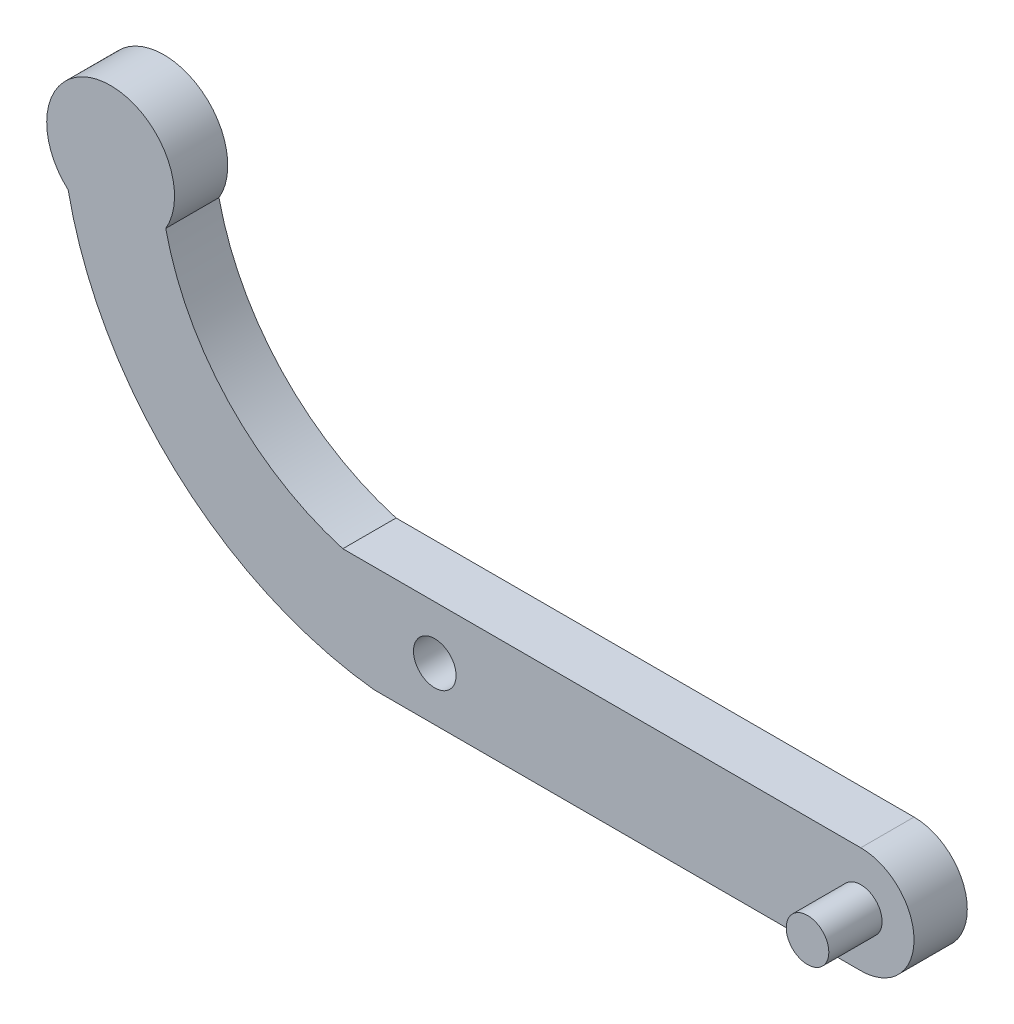
ISO-10303-21;
HEADER;
FILE_DESCRIPTION(('STEP AP214'),'2;1');
FILE_NAME('part.step','',(''),(''),'','','');
FILE_SCHEMA(('AUTOMOTIVE_DESIGN { 1 0 10303 214 1 1 1 1 }'));
ENDSEC;
DATA;
#1=APPLICATION_CONTEXT('core data for automotive mechanical design processes');
#2=APPLICATION_PROTOCOL_DEFINITION('international standard','automotive_design',2000,#1);
#3=PRODUCT_CONTEXT('',#1,'mechanical');
#4=PRODUCT('Part','Part','',(#3));
#5=PRODUCT_RELATED_PRODUCT_CATEGORY('part','',(#4));
#6=PRODUCT_DEFINITION_FORMATION('','',#4);
#7=PRODUCT_DEFINITION_CONTEXT('part definition',#1,'design');
#8=PRODUCT_DEFINITION('design','',#6,#7);
#9=PRODUCT_DEFINITION_SHAPE('','',#8);
#10=(LENGTH_UNIT() NAMED_UNIT(*) SI_UNIT(.MILLI.,.METRE.));
#11=(NAMED_UNIT(*) PLANE_ANGLE_UNIT() SI_UNIT($,.RADIAN.));
#12=(NAMED_UNIT(*) SI_UNIT($,.STERADIAN.) SOLID_ANGLE_UNIT());
#13=UNCERTAINTY_MEASURE_WITH_UNIT(LENGTH_MEASURE(1.E-05),#10,'distance_accuracy_value','');
#14=(GEOMETRIC_REPRESENTATION_CONTEXT(3) GLOBAL_UNCERTAINTY_ASSIGNED_CONTEXT((#13)) GLOBAL_UNIT_ASSIGNED_CONTEXT((#10,
#11,#12)) REPRESENTATION_CONTEXT('',''));
#15=CARTESIAN_POINT('',(0.,0.,0.));
#16=DIRECTION('',(0.,0.,1.));
#17=DIRECTION('',(1.,0.,0.));
#18=AXIS2_PLACEMENT_3D('',#15,#16,#17);
#19=CARTESIAN_POINT('',(-19.2924587651083,28.7084113729155,5.));
#20=DIRECTION('',(0.,0.,1.));
#21=DIRECTION('',(1.,0.,0.));
#22=AXIS2_PLACEMENT_3D('',#19,#20,#21);
#23=PLANE('',#22);
#24=CARTESIAN_POINT('',(22.6780509076825,0.804713338237159,5.));
#25=DIRECTION('',(0.,0.,1.));
#26=DIRECTION('',(1.,0.,0.));
#27=AXIS2_PLACEMENT_3D('',#24,#25,#26);
#28=CIRCLE('',#27,2.);
#29=CARTESIAN_POINT('',(24.6780509076825,0.804713338237159,5.));
#30=VERTEX_POINT('',#29);
#31=EDGE_CURVE('E176',#30,#30,#28,.T.);
#32=ORIENTED_EDGE('',*,*,#31,.F.);
#33=EDGE_LOOP('',(#32));
#34=FACE_BOUND('',#33,.T.);
#35=CARTESIAN_POINT('',(-19.2924587651083,28.7084113729155,5.));
#36=DIRECTION('',(0.,0.,-1.));
#37=DIRECTION('',(1.,0.,0.));
#38=AXIS2_PLACEMENT_3D('',#35,#36,#37);
#39=CIRCLE('',#38,23.8526946732791);
#40=CARTESIAN_POINT('',(-25.9536643251366,5.80471333823716,5.));
#41=VERTEX_POINT('',#40);
#42=CARTESIAN_POINT('',(-42.5787439773952,23.5412105650593,5.));
#43=VERTEX_POINT('',#42);
#44=EDGE_CURVE('E129',#41,#43,#39,.T.);
#45=ORIENTED_EDGE('',*,*,#44,.T.);
#46=CARTESIAN_POINT('',(-47.7560673642883,26.5735895894443,5.));
#47=DIRECTION('',(0.,0.,1.));
#48=DIRECTION('',(1.,0.,0.));
#49=AXIS2_PLACEMENT_3D('',#46,#47,#48);
#50=CIRCLE('',#49,6.);
#51=CARTESIAN_POINT('',(-51.7412575093746,22.0882513070505,5.));
#52=VERTEX_POINT('',#51);
#53=EDGE_CURVE('E87',#43,#52,#50,.T.);
#54=ORIENTED_EDGE('',*,*,#53,.T.);
#55=CARTESIAN_POINT('',(-19.2924587651083,28.7084113729155,5.));
#56=DIRECTION('',(0.,0.,1.));
#57=DIRECTION('',(1.,0.,0.));
#58=AXIS2_PLACEMENT_3D('',#55,#56,#57);
#59=CIRCLE('',#58,33.1172320589081);
#60=CARTESIAN_POINT('',(-23.0471511474845,-4.19528666176284,5.));
#61=VERTEX_POINT('',#60);
#62=EDGE_CURVE('E100',#52,#61,#59,.T.);
#63=ORIENTED_EDGE('',*,*,#62,.T.);
#64=DIRECTION('',(1.,0.,0.));
#65=VECTOR('',#64,1.);
#66=CARTESIAN_POINT('',(-23.0471511474845,-4.19528666176284,5.));
#67=LINE('',#66,#65);
#68=CARTESIAN_POINT('',(22.6780509076825,-4.19528666176284,5.));
#69=VERTEX_POINT('',#68);
#70=EDGE_CURVE('E94',#61,#69,#67,.T.);
#71=ORIENTED_EDGE('',*,*,#70,.T.);
#72=CARTESIAN_POINT('',(22.6780509076825,0.804713338237159,5.));
#73=DIRECTION('',(0.,0.,1.));
#74=DIRECTION('',(1.,0.,0.));
#75=AXIS2_PLACEMENT_3D('',#72,#73,#74);
#76=CIRCLE('',#75,5.);
#77=CARTESIAN_POINT('',(22.6780509076825,5.80471333823716,5.));
#78=VERTEX_POINT('',#77);
#79=EDGE_CURVE('E98',#69,#78,#76,.T.);
#80=ORIENTED_EDGE('',*,*,#79,.T.);
#81=DIRECTION('',(-1.,0.,0.));
#82=VECTOR('',#81,1.);
#83=CARTESIAN_POINT('',(-25.9536643251366,5.80471333823716,5.));
#84=LINE('',#83,#82);
#85=EDGE_CURVE('E50',#78,#41,#84,.T.);
#86=ORIENTED_EDGE('',*,*,#85,.T.);
#87=EDGE_LOOP('',(#45,#54,#63,#71,#80,#86));
#88=FACE_BOUND('',#87,.T.);
#89=CARTESIAN_POINT('',(-17.3219490923175,0.804713338237159,5.));
#90=DIRECTION('',(0.,0.,1.));
#91=DIRECTION('',(1.,0.,0.));
#92=AXIS2_PLACEMENT_3D('',#89,#90,#91);
#93=CIRCLE('',#92,2.);
#94=CARTESIAN_POINT('',(-15.3219490923175,0.804713338237159,5.));
#95=VERTEX_POINT('',#94);
#96=EDGE_CURVE('E122',#95,#95,#93,.T.);
#97=ORIENTED_EDGE('',*,*,#96,.F.);
#98=EDGE_LOOP('',(#97));
#99=FACE_BOUND('',#98,.T.);
#100=ADVANCED_FACE('F33',(#34,#88,#99),#23,.T.);
#101=CARTESIAN_POINT('',(-19.2924587651083,28.7084113729155,0.));
#102=DIRECTION('',(0.,0.,1.));
#103=DIRECTION('',(1.,0.,0.));
#104=AXIS2_PLACEMENT_3D('',#101,#102,#103);
#105=PLANE('',#104);
#106=CARTESIAN_POINT('',(-19.2924587651083,28.7084113729155,0.));
#107=DIRECTION('',(0.,0.,-1.));
#108=DIRECTION('',(1.,0.,0.));
#109=AXIS2_PLACEMENT_3D('',#106,#107,#108);
#110=CIRCLE('',#109,23.8526946732791);
#111=CARTESIAN_POINT('',(-25.9536643251366,5.80471333823716,0.));
#112=VERTEX_POINT('',#111);
#113=CARTESIAN_POINT('',(-42.5787439773952,23.5412105650593,0.));
#114=VERTEX_POINT('',#113);
#115=EDGE_CURVE('E118',#112,#114,#110,.T.);
#116=ORIENTED_EDGE('',*,*,#115,.F.);
#117=DIRECTION('',(-1.,0.,0.));
#118=VECTOR('',#117,1.);
#119=CARTESIAN_POINT('',(-25.9536643251366,5.80471333823716,0.));
#120=LINE('',#119,#118);
#121=CARTESIAN_POINT('',(22.6780509076825,5.80471333823716,0.));
#122=VERTEX_POINT('',#121);
#123=EDGE_CURVE('E79',#122,#112,#120,.T.);
#124=ORIENTED_EDGE('',*,*,#123,.F.);
#125=CARTESIAN_POINT('',(22.6780509076825,0.804713338237159,0.));
#126=DIRECTION('',(0.,0.,1.));
#127=DIRECTION('',(1.,0.,0.));
#128=AXIS2_PLACEMENT_3D('',#125,#126,#127);
#129=CIRCLE('',#128,5.);
#130=CARTESIAN_POINT('',(22.6780509076825,-4.19528666176284,0.));
#131=VERTEX_POINT('',#130);
#132=EDGE_CURVE('E73',#131,#122,#129,.T.);
#133=ORIENTED_EDGE('',*,*,#132,.F.);
#134=DIRECTION('',(1.,0.,0.));
#135=VECTOR('',#134,1.);
#136=CARTESIAN_POINT('',(-23.0471511474845,-4.19528666176284,0.));
#137=LINE('',#136,#135);
#138=CARTESIAN_POINT('',(-23.0471511474845,-4.19528666176284,0.));
#139=VERTEX_POINT('',#138);
#140=EDGE_CURVE('E108',#139,#131,#137,.T.);
#141=ORIENTED_EDGE('',*,*,#140,.F.);
#142=CARTESIAN_POINT('',(-19.2924587651083,28.7084113729155,0.));
#143=DIRECTION('',(0.,0.,1.));
#144=DIRECTION('',(1.,0.,0.));
#145=AXIS2_PLACEMENT_3D('',#142,#143,#144);
#146=CIRCLE('',#145,33.1172320589081);
#147=CARTESIAN_POINT('',(-51.7412575093746,22.0882513070505,0.));
#148=VERTEX_POINT('',#147);
#149=EDGE_CURVE('E124',#148,#139,#146,.T.);
#150=ORIENTED_EDGE('',*,*,#149,.F.);
#151=CARTESIAN_POINT('',(-47.7560673642883,26.5735895894443,0.));
#152=DIRECTION('',(0.,0.,1.));
#153=DIRECTION('',(1.,0.,0.));
#154=AXIS2_PLACEMENT_3D('',#151,#152,#153);
#155=CIRCLE('',#154,6.);
#156=EDGE_CURVE('E121',#114,#148,#155,.T.);
#157=ORIENTED_EDGE('',*,*,#156,.F.);
#158=EDGE_LOOP('',(#116,#124,#133,#141,#150,#157));
#159=FACE_BOUND('',#158,.T.);
#160=CARTESIAN_POINT('',(-17.3219490923175,0.804713338237159,0.));
#161=DIRECTION('',(0.,0.,1.));
#162=DIRECTION('',(1.,0.,0.));
#163=AXIS2_PLACEMENT_3D('',#160,#161,#162);
#164=CIRCLE('',#163,2.);
#165=CARTESIAN_POINT('',(-15.3219490923175,0.804713338237159,0.));
#166=VERTEX_POINT('',#165);
#167=EDGE_CURVE('E175',#166,#166,#164,.T.);
#168=ORIENTED_EDGE('',*,*,#167,.T.);
#169=EDGE_LOOP('',(#168));
#170=FACE_BOUND('',#169,.T.);
#171=ADVANCED_FACE('F138',(#159,#170),#105,.F.);
#172=CARTESIAN_POINT('',(-19.2924587651083,28.7084113729155,5.));
#173=DIRECTION('',(0.,0.,-1.));
#174=DIRECTION('',(-1.,0.,0.));
#175=AXIS2_PLACEMENT_3D('',#172,#173,#174);
#176=CYLINDRICAL_SURFACE('',#175,23.8526946732791);
#177=ORIENTED_EDGE('',*,*,#115,.T.);
#178=DIRECTION('',(0.,0.,-1.));
#179=VECTOR('',#178,1.);
#180=CARTESIAN_POINT('',(-42.5787439773952,23.5412105650593,5.));
#181=LINE('',#180,#179);
#182=EDGE_CURVE('E11',#43,#114,#181,.T.);
#183=ORIENTED_EDGE('',*,*,#182,.F.);
#184=ORIENTED_EDGE('',*,*,#44,.F.);
#185=DIRECTION('',(0.,0.,-1.));
#186=VECTOR('',#185,1.);
#187=CARTESIAN_POINT('',(-25.9536643251366,5.80471333823716,5.));
#188=LINE('',#187,#186);
#189=EDGE_CURVE('E114',#41,#112,#188,.T.);
#190=ORIENTED_EDGE('',*,*,#189,.T.);
#191=EDGE_LOOP('',(#177,#183,#184,#190));
#192=FACE_BOUND('',#191,.T.);
#193=ADVANCED_FACE('F35',(#192),#176,.F.);
#194=CARTESIAN_POINT('',(-47.7560673642883,26.5735895894443,5.));
#195=DIRECTION('',(0.,0.,-1.));
#196=DIRECTION('',(-1.,0.,0.));
#197=AXIS2_PLACEMENT_3D('',#194,#195,#196);
#198=CYLINDRICAL_SURFACE('',#197,6.);
#199=ORIENTED_EDGE('',*,*,#156,.T.);
#200=DIRECTION('',(0.,0.,-1.));
#201=VECTOR('',#200,1.);
#202=CARTESIAN_POINT('',(-51.7412575093746,22.0882513070505,5.));
#203=LINE('',#202,#201);
#204=EDGE_CURVE('E42',#52,#148,#203,.T.);
#205=ORIENTED_EDGE('',*,*,#204,.F.);
#206=ORIENTED_EDGE('',*,*,#53,.F.);
#207=ORIENTED_EDGE('',*,*,#182,.T.);
#208=EDGE_LOOP('',(#199,#205,#206,#207));
#209=FACE_BOUND('',#208,.T.);
#210=ADVANCED_FACE('F220',(#209),#198,.T.);
#211=CARTESIAN_POINT('',(-19.2924587651083,28.7084113729155,5.));
#212=DIRECTION('',(0.,0.,-1.));
#213=DIRECTION('',(-1.,0.,0.));
#214=AXIS2_PLACEMENT_3D('',#211,#212,#213);
#215=CYLINDRICAL_SURFACE('',#214,33.1172320589081);
#216=ORIENTED_EDGE('',*,*,#149,.T.);
#217=DIRECTION('',(0.,0.,-1.));
#218=VECTOR('',#217,1.);
#219=CARTESIAN_POINT('',(-23.0471511474845,-4.19528666176284,5.));
#220=LINE('',#219,#218);
#221=EDGE_CURVE('E109',#61,#139,#220,.T.);
#222=ORIENTED_EDGE('',*,*,#221,.F.);
#223=ORIENTED_EDGE('',*,*,#62,.F.);
#224=ORIENTED_EDGE('',*,*,#204,.T.);
#225=EDGE_LOOP('',(#216,#222,#223,#224));
#226=FACE_BOUND('',#225,.T.);
#227=ADVANCED_FACE('F135',(#226),#215,.T.);
#228=CARTESIAN_POINT('',(-23.0471511474845,-4.19528666176284,5.));
#229=DIRECTION('',(0.,1.,0.));
#230=DIRECTION('',(-1.,0.,0.));
#231=AXIS2_PLACEMENT_3D('',#228,#229,#230);
#232=PLANE('',#231);
#233=ORIENTED_EDGE('',*,*,#140,.T.);
#234=DIRECTION('',(0.,0.,-1.));
#235=VECTOR('',#234,1.);
#236=CARTESIAN_POINT('',(22.6780509076825,-4.19528666176284,5.));
#237=LINE('',#236,#235);
#238=EDGE_CURVE('E105',#69,#131,#237,.T.);
#239=ORIENTED_EDGE('',*,*,#238,.F.);
#240=ORIENTED_EDGE('',*,*,#70,.F.);
#241=ORIENTED_EDGE('',*,*,#221,.T.);
#242=EDGE_LOOP('',(#233,#239,#240,#241));
#243=FACE_BOUND('',#242,.T.);
#244=ADVANCED_FACE('F106',(#243),#232,.F.);
#245=CARTESIAN_POINT('',(22.6780509076825,0.804713338237159,5.));
#246=DIRECTION('',(0.,0.,-1.));
#247=DIRECTION('',(-1.,0.,0.));
#248=AXIS2_PLACEMENT_3D('',#245,#246,#247);
#249=CYLINDRICAL_SURFACE('',#248,5.);
#250=ORIENTED_EDGE('',*,*,#132,.T.);
#251=DIRECTION('',(0.,0.,-1.));
#252=VECTOR('',#251,1.);
#253=CARTESIAN_POINT('',(22.6780509076825,5.80471333823716,5.));
#254=LINE('',#253,#252);
#255=EDGE_CURVE('E110',#78,#122,#254,.T.);
#256=ORIENTED_EDGE('',*,*,#255,.F.);
#257=ORIENTED_EDGE('',*,*,#79,.F.);
#258=ORIENTED_EDGE('',*,*,#238,.T.);
#259=EDGE_LOOP('',(#250,#256,#257,#258));
#260=FACE_BOUND('',#259,.T.);
#261=ADVANCED_FACE('F112',(#260),#249,.T.);
#262=CARTESIAN_POINT('',(-25.9536643251366,5.80471333823716,5.));
#263=DIRECTION('',(0.,-1.,0.));
#264=DIRECTION('',(1.,0.,0.));
#265=AXIS2_PLACEMENT_3D('',#262,#263,#264);
#266=PLANE('',#265);
#267=ORIENTED_EDGE('',*,*,#123,.T.);
#268=ORIENTED_EDGE('',*,*,#189,.F.);
#269=ORIENTED_EDGE('',*,*,#85,.F.);
#270=ORIENTED_EDGE('',*,*,#255,.T.);
#271=EDGE_LOOP('',(#267,#268,#269,#270));
#272=FACE_BOUND('',#271,.T.);
#273=ADVANCED_FACE('F143',(#272),#266,.F.);
#274=CARTESIAN_POINT('',(-17.3219490923175,0.804713338237159,5.));
#275=DIRECTION('',(0.,0.,-1.));
#276=DIRECTION('',(-1.,0.,0.));
#277=AXIS2_PLACEMENT_3D('',#274,#275,#276);
#278=CYLINDRICAL_SURFACE('',#277,2.);
#279=ORIENTED_EDGE('',*,*,#96,.T.);
#280=EDGE_LOOP('',(#279));
#281=FACE_BOUND('',#280,.T.);
#282=ORIENTED_EDGE('',*,*,#167,.F.);
#283=EDGE_LOOP('',(#282));
#284=FACE_BOUND('',#283,.T.);
#285=ADVANCED_FACE('F145',(#281,#284),#278,.F.);
#286=CARTESIAN_POINT('',(22.6780509076825,0.804713338237159,10.));
#287=DIRECTION('',(0.,0.,-1.));
#288=DIRECTION('',(-1.,0.,0.));
#289=AXIS2_PLACEMENT_3D('',#286,#287,#288);
#290=CYLINDRICAL_SURFACE('',#289,2.);
#291=CARTESIAN_POINT('',(22.6780509076825,0.804713338237159,10.));
#292=DIRECTION('',(0.,0.,1.));
#293=DIRECTION('',(1.,0.,0.));
#294=AXIS2_PLACEMENT_3D('',#291,#292,#293);
#295=CIRCLE('',#294,2.);
#296=CARTESIAN_POINT('',(24.6780509076825,0.804713338237159,10.));
#297=VERTEX_POINT('',#296);
#298=EDGE_CURVE('E174',#297,#297,#295,.T.);
#299=ORIENTED_EDGE('',*,*,#298,.F.);
#300=EDGE_LOOP('',(#299));
#301=FACE_BOUND('',#300,.T.);
#302=ORIENTED_EDGE('',*,*,#31,.T.);
#303=EDGE_LOOP('',(#302));
#304=FACE_BOUND('',#303,.T.);
#305=ADVANCED_FACE('F151',(#301,#304),#290,.T.);
#306=CARTESIAN_POINT('',(22.6780509076825,0.804713338237159,10.));
#307=DIRECTION('',(0.,0.,1.));
#308=DIRECTION('',(1.,0.,0.));
#309=AXIS2_PLACEMENT_3D('',#306,#307,#308);
#310=PLANE('',#309);
#311=ORIENTED_EDGE('',*,*,#298,.T.);
#312=EDGE_LOOP('',(#311));
#313=FACE_BOUND('',#312,.T.);
#314=ADVANCED_FACE('F166',(#313),#310,.T.);
#315=CLOSED_SHELL('',(#100,#171,#193,#210,#227,#244,#261,#273,#285,#305,#314));
#316=MANIFOLD_SOLID_BREP('B2',#315);
#317=ADVANCED_BREP_SHAPE_REPRESENTATION('',(#18,#316),#14);
#318=SHAPE_DEFINITION_REPRESENTATION(#9,#317);
ENDSEC;
END-ISO-10303-21;
